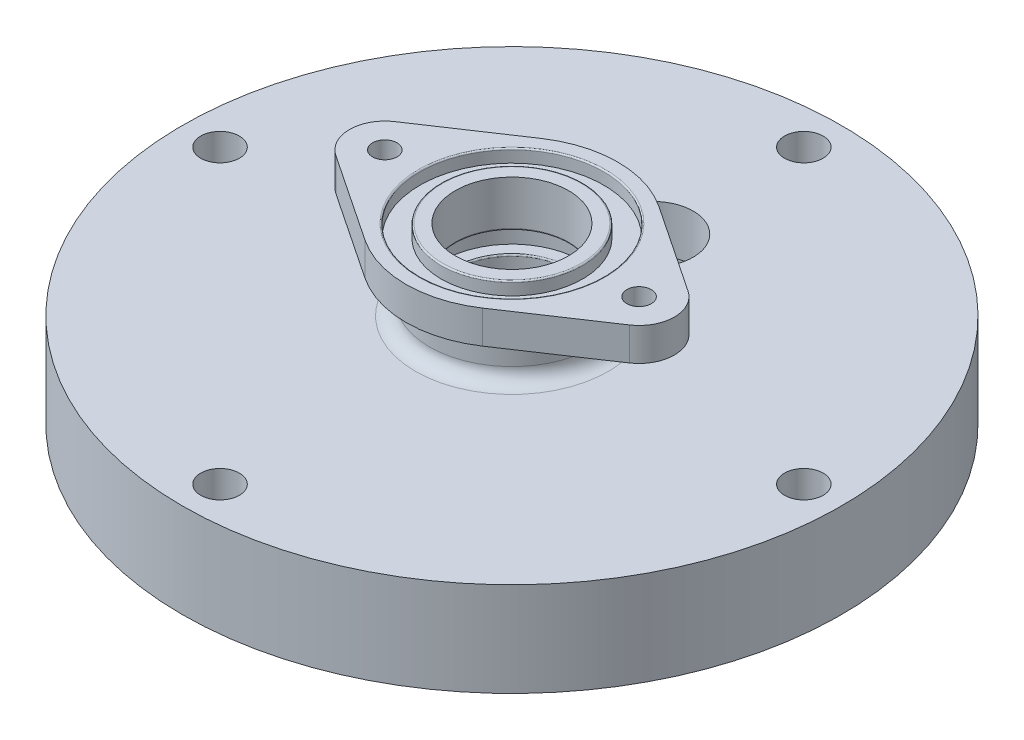
ISO-10303-21;
HEADER;
FILE_DESCRIPTION(('STEP AP214'),'2;1');
FILE_NAME('part.step','',(''),(''),'','','');
FILE_SCHEMA(('AUTOMOTIVE_DESIGN { 1 0 10303 214 1 1 1 1 }'));
ENDSEC;
DATA;
#1=APPLICATION_CONTEXT('core data for automotive mechanical design processes');
#2=APPLICATION_PROTOCOL_DEFINITION('international standard','automotive_design',2000,#1);
#3=PRODUCT_CONTEXT('',#1,'mechanical');
#4=PRODUCT('Part','Part','',(#3));
#5=PRODUCT_RELATED_PRODUCT_CATEGORY('part','',(#4));
#6=PRODUCT_DEFINITION_FORMATION('','',#4);
#7=PRODUCT_DEFINITION_CONTEXT('part definition',#1,'design');
#8=PRODUCT_DEFINITION('design','',#6,#7);
#9=PRODUCT_DEFINITION_SHAPE('','',#8);
#10=(LENGTH_UNIT() NAMED_UNIT(*) SI_UNIT(.MILLI.,.METRE.));
#11=(NAMED_UNIT(*) PLANE_ANGLE_UNIT() SI_UNIT($,.RADIAN.));
#12=(NAMED_UNIT(*) SI_UNIT($,.STERADIAN.) SOLID_ANGLE_UNIT());
#13=UNCERTAINTY_MEASURE_WITH_UNIT(LENGTH_MEASURE(1.E-05),#10,'distance_accuracy_value','');
#14=(GEOMETRIC_REPRESENTATION_CONTEXT(3) GLOBAL_UNCERTAINTY_ASSIGNED_CONTEXT((#13)) GLOBAL_UNIT_ASSIGNED_CONTEXT((#10,
#11,#12)) REPRESENTATION_CONTEXT('',''));
#15=CARTESIAN_POINT('',(0.,0.,0.));
#16=DIRECTION('',(0.,0.,1.));
#17=DIRECTION('',(1.,0.,0.));
#18=AXIS2_PLACEMENT_3D('',#15,#16,#17);
#19=CARTESIAN_POINT('',(0.,0.,0.));
#20=DIRECTION('',(0.,1.,0.));
#21=DIRECTION('',(0.,0.,1.));
#22=AXIS2_PLACEMENT_3D('',#19,#20,#21);
#23=CYLINDRICAL_SURFACE('',#22,12.025);
#24=CARTESIAN_POINT('',(0.,27.5318590738035,0.));
#25=DIRECTION('',(0.,1.,0.));
#26=DIRECTION('',(0.,0.,1.));
#27=AXIS2_PLACEMENT_3D('',#24,#25,#26);
#28=CIRCLE('',#27,12.025);
#29=CARTESIAN_POINT('',(0.,27.5318590738035,12.025));
#30=VERTEX_POINT('',#29);
#31=EDGE_CURVE('E215',#30,#30,#28,.F.);
#32=ORIENTED_EDGE('',*,*,#31,.T.);
#33=EDGE_LOOP('',(#32));
#34=FACE_BOUND('',#33,.T.);
#35=CARTESIAN_POINT('',(0.,37.,0.));
#36=DIRECTION('',(0.,1.,0.));
#37=DIRECTION('',(0.,0.,1.));
#38=AXIS2_PLACEMENT_3D('',#35,#36,#37);
#39=CIRCLE('',#38,12.025);
#40=CARTESIAN_POINT('',(0.,37.,12.025));
#41=VERTEX_POINT('',#40);
#42=EDGE_CURVE('E397',#41,#41,#39,.T.);
#43=ORIENTED_EDGE('',*,*,#42,.T.);
#44=EDGE_LOOP('',(#43));
#45=FACE_BOUND('',#44,.T.);
#46=ADVANCED_FACE('F38',(#34,#45),#23,.F.);
#47=CARTESIAN_POINT('',(-27.,37.,0.));
#48=DIRECTION('',(0.,1.,0.));
#49=DIRECTION('',(0.,0.,1.));
#50=AXIS2_PLACEMENT_3D('',#47,#48,#49);
#51=PLANE('',#50);
#52=CARTESIAN_POINT('',(0.,37.,0.));
#53=DIRECTION('',(0.,1.,0.));
#54=DIRECTION('',(0.,0.,1.));
#55=AXIS2_PLACEMENT_3D('',#52,#53,#54);
#56=CIRCLE('',#55,14.725);
#57=CARTESIAN_POINT('',(0.,37.,14.725));
#58=VERTEX_POINT('',#57);
#59=EDGE_CURVE('E197',#58,#58,#56,.T.);
#60=ORIENTED_EDGE('',*,*,#59,.T.);
#61=EDGE_LOOP('',(#60));
#62=FACE_BOUND('',#61,.T.);
#63=ORIENTED_EDGE('',*,*,#42,.F.);
#64=EDGE_LOOP('',(#63));
#65=FACE_BOUND('',#64,.T.);
#66=ADVANCED_FACE('F241',(#62,#65),#51,.T.);
#67=CARTESIAN_POINT('',(0.,20.,0.));
#68=DIRECTION('',(0.,-1.,0.));
#69=DIRECTION('',(0.,0.,-1.));
#70=AXIS2_PLACEMENT_3D('',#67,#68,#69);
#71=CYLINDRICAL_SURFACE('',#70,70.);
#72=CARTESIAN_POINT('',(0.,20.,0.));
#73=DIRECTION('',(0.,1.,0.));
#74=DIRECTION('',(0.,0.,1.));
#75=AXIS2_PLACEMENT_3D('',#72,#73,#74);
#76=CIRCLE('',#75,70.);
#77=CARTESIAN_POINT('',(0.,20.,70.));
#78=VERTEX_POINT('',#77);
#79=EDGE_CURVE('E186',#78,#78,#76,.T.);
#80=ORIENTED_EDGE('',*,*,#79,.F.);
#81=EDGE_LOOP('',(#80));
#82=FACE_BOUND('',#81,.T.);
#83=CARTESIAN_POINT('',(0.,0.,0.));
#84=DIRECTION('',(0.,1.,0.));
#85=DIRECTION('',(0.,0.,1.));
#86=AXIS2_PLACEMENT_3D('',#83,#84,#85);
#87=CIRCLE('',#86,70.);
#88=CARTESIAN_POINT('',(0.,0.,70.));
#89=VERTEX_POINT('',#88);
#90=EDGE_CURVE('E185',#89,#89,#87,.T.);
#91=ORIENTED_EDGE('',*,*,#90,.T.);
#92=EDGE_LOOP('',(#91));
#93=FACE_BOUND('',#92,.T.);
#94=ADVANCED_FACE('F247',(#82,#93),#71,.T.);
#95=CARTESIAN_POINT('',(0.,20.,0.));
#96=DIRECTION('',(0.,1.,0.));
#97=DIRECTION('',(0.,0.,1.));
#98=AXIS2_PLACEMENT_3D('',#95,#96,#97);
#99=PLANE('',#98);
#100=CARTESIAN_POINT('',(0.,20.,-30.));
#101=DIRECTION('',(0.,1.,0.));
#102=DIRECTION('',(0.,0.,1.));
#103=AXIS2_PLACEMENT_3D('',#100,#101,#102);
#104=CIRCLE('',#103,8.5);
#105=CARTESIAN_POINT('',(0.,20.,-21.5));
#106=VERTEX_POINT('',#105);
#107=EDGE_CURVE('E466',#106,#106,#104,.T.);
#108=ORIENTED_EDGE('',*,*,#107,.F.);
#109=EDGE_LOOP('',(#108));
#110=FACE_BOUND('',#109,.T.);
#111=CARTESIAN_POINT('',(0.,20.,-62.));
#112=DIRECTION('',(0.,1.,0.));
#113=DIRECTION('',(0.,0.,1.));
#114=AXIS2_PLACEMENT_3D('',#111,#112,#113);
#115=CIRCLE('',#114,4.1);
#116=CARTESIAN_POINT('',(0.,20.,-57.9));
#117=VERTEX_POINT('',#116);
#118=EDGE_CURVE('E479',#117,#117,#115,.T.);
#119=ORIENTED_EDGE('',*,*,#118,.F.);
#120=EDGE_LOOP('',(#119));
#121=FACE_BOUND('',#120,.T.);
#122=CARTESIAN_POINT('',(62.0000000000018,20.,-1.75455317453033E-12));
#123=DIRECTION('',(0.,1.,0.));
#124=DIRECTION('',(0.,0.,1.));
#125=AXIS2_PLACEMENT_3D('',#122,#123,#124);
#126=CIRCLE('',#125,4.10000000000137);
#127=CARTESIAN_POINT('',(62.0000000000018,20.,4.09999999999962));
#128=VERTEX_POINT('',#127);
#129=EDGE_CURVE('E485',#128,#128,#126,.T.);
#130=ORIENTED_EDGE('',*,*,#129,.F.);
#131=EDGE_LOOP('',(#130));
#132=FACE_BOUND('',#131,.T.);
#133=CARTESIAN_POINT('',(3.50910634906067E-12,20.,62.));
#134=DIRECTION('',(0.,1.,0.));
#135=DIRECTION('',(0.,0.,1.));
#136=AXIS2_PLACEMENT_3D('',#133,#134,#135);
#137=CIRCLE('',#136,4.10000000000377);
#138=CARTESIAN_POINT('',(3.50910634906067E-12,20.,66.1000000000038));
#139=VERTEX_POINT('',#138);
#140=EDGE_CURVE('E491',#139,#139,#137,.T.);
#141=ORIENTED_EDGE('',*,*,#140,.F.);
#142=EDGE_LOOP('',(#141));
#143=FACE_BOUND('',#142,.T.);
#144=CARTESIAN_POINT('',(-61.9999999999983,20.,1.76214598468505E-12));
#145=DIRECTION('',(0.,1.,0.));
#146=DIRECTION('',(0.,0.,1.));
#147=AXIS2_PLACEMENT_3D('',#144,#145,#146);
#148=CIRCLE('',#147,4.10000000000282);
#149=CARTESIAN_POINT('',(-61.9999999999983,20.,4.10000000000458));
#150=VERTEX_POINT('',#149);
#151=EDGE_CURVE('E472',#150,#150,#148,.T.);
#152=ORIENTED_EDGE('',*,*,#151,.F.);
#153=EDGE_LOOP('',(#152));
#154=FACE_BOUND('',#153,.T.);
#155=CARTESIAN_POINT('',(0.,20.,0.));
#156=DIRECTION('',(0.,1.,0.));
#157=DIRECTION('',(0.,0.,1.));
#158=AXIS2_PLACEMENT_3D('',#155,#156,#157);
#159=CIRCLE('',#158,20.5);
#160=CARTESIAN_POINT('',(0.,20.,20.5));
#161=VERTEX_POINT('',#160);
#162=EDGE_CURVE('E212',#161,#161,#159,.F.);
#163=ORIENTED_EDGE('',*,*,#162,.T.);
#164=EDGE_LOOP('',(#163));
#165=FACE_BOUND('',#164,.T.);
#166=ORIENTED_EDGE('',*,*,#79,.T.);
#167=EDGE_LOOP('',(#166));
#168=FACE_BOUND('',#167,.T.);
#169=ADVANCED_FACE('F331',(#110,#121,#132,#143,#154,#165,#168),#99,.T.);
#170=CARTESIAN_POINT('',(0.,0.,0.));
#171=DIRECTION('',(0.,1.,0.));
#172=DIRECTION('',(0.,0.,1.));
#173=AXIS2_PLACEMENT_3D('',#170,#171,#172);
#174=PLANE('',#173);
#175=CARTESIAN_POINT('',(0.,0.,-62.));
#176=DIRECTION('',(0.,1.,0.));
#177=DIRECTION('',(0.,0.,1.));
#178=AXIS2_PLACEMENT_3D('',#175,#176,#177);
#179=CIRCLE('',#178,4.1);
#180=CARTESIAN_POINT('',(0.,0.,-57.9));
#181=VERTEX_POINT('',#180);
#182=EDGE_CURVE('E475',#181,#181,#179,.T.);
#183=ORIENTED_EDGE('',*,*,#182,.T.);
#184=EDGE_LOOP('',(#183));
#185=FACE_BOUND('',#184,.T.);
#186=CARTESIAN_POINT('',(62.0000000000018,0.,-1.75455317453033E-12));
#187=DIRECTION('',(0.,1.,0.));
#188=DIRECTION('',(0.,0.,1.));
#189=AXIS2_PLACEMENT_3D('',#186,#187,#188);
#190=CIRCLE('',#189,4.10000000000137);
#191=CARTESIAN_POINT('',(62.0000000000018,0.,4.09999999999962));
#192=VERTEX_POINT('',#191);
#193=EDGE_CURVE('E482',#192,#192,#190,.T.);
#194=ORIENTED_EDGE('',*,*,#193,.T.);
#195=EDGE_LOOP('',(#194));
#196=FACE_BOUND('',#195,.T.);
#197=CARTESIAN_POINT('',(3.50910634906067E-12,0.,62.));
#198=DIRECTION('',(0.,1.,0.));
#199=DIRECTION('',(0.,0.,1.));
#200=AXIS2_PLACEMENT_3D('',#197,#198,#199);
#201=CIRCLE('',#200,4.10000000000377);
#202=CARTESIAN_POINT('',(3.50910634906067E-12,0.,66.1000000000038));
#203=VERTEX_POINT('',#202);
#204=EDGE_CURVE('E488',#203,#203,#201,.T.);
#205=ORIENTED_EDGE('',*,*,#204,.T.);
#206=EDGE_LOOP('',(#205));
#207=FACE_BOUND('',#206,.T.);
#208=CARTESIAN_POINT('',(-61.9999999999983,0.,1.76214598468505E-12));
#209=DIRECTION('',(0.,1.,0.));
#210=DIRECTION('',(0.,0.,1.));
#211=AXIS2_PLACEMENT_3D('',#208,#209,#210);
#212=CIRCLE('',#211,4.10000000000282);
#213=CARTESIAN_POINT('',(-61.9999999999983,0.,4.10000000000458));
#214=VERTEX_POINT('',#213);
#215=EDGE_CURVE('E494',#214,#214,#212,.T.);
#216=ORIENTED_EDGE('',*,*,#215,.T.);
#217=EDGE_LOOP('',(#216));
#218=FACE_BOUND('',#217,.T.);
#219=CARTESIAN_POINT('',(0.,0.,0.));
#220=DIRECTION('',(0.,-1.,0.));
#221=DIRECTION('',(0.,0.,-1.));
#222=AXIS2_PLACEMENT_3D('',#219,#220,#221);
#223=CIRCLE('',#222,50.03);
#224=CARTESIAN_POINT('',(0.,0.,-50.03));
#225=VERTEX_POINT('',#224);
#226=EDGE_CURVE('E182',#225,#225,#223,.T.);
#227=ORIENTED_EDGE('',*,*,#226,.F.);
#228=EDGE_LOOP('',(#227));
#229=FACE_BOUND('',#228,.T.);
#230=ORIENTED_EDGE('',*,*,#90,.F.);
#231=EDGE_LOOP('',(#230));
#232=FACE_BOUND('',#231,.T.);
#233=ADVANCED_FACE('F329',(#185,#196,#207,#218,#229,#232),#174,.F.);
#234=CARTESIAN_POINT('',(0.,10.,0.));
#235=DIRECTION('',(0.,-1.,0.));
#236=DIRECTION('',(0.,0.,-1.));
#237=AXIS2_PLACEMENT_3D('',#234,#235,#236);
#238=CYLINDRICAL_SURFACE('',#237,45.);
#239=CARTESIAN_POINT('',(0.,0.,0.));
#240=DIRECTION('',(0.,-1.,0.));
#241=DIRECTION('',(0.,0.,-1.));
#242=AXIS2_PLACEMENT_3D('',#239,#240,#241);
#243=CIRCLE('',#242,45.);
#244=CARTESIAN_POINT('',(0.,0.,-45.));
#245=VERTEX_POINT('',#244);
#246=EDGE_CURVE('E177',#245,#245,#243,.T.);
#247=ORIENTED_EDGE('',*,*,#246,.F.);
#248=EDGE_LOOP('',(#247));
#249=FACE_BOUND('',#248,.T.);
#250=CARTESIAN_POINT('',(0.,13.,0.));
#251=DIRECTION('',(0.,-1.,0.));
#252=DIRECTION('',(0.,0.,-1.));
#253=AXIS2_PLACEMENT_3D('',#250,#251,#252);
#254=CIRCLE('',#253,45.);
#255=CARTESIAN_POINT('',(0.,13.,-45.));
#256=VERTEX_POINT('',#255);
#257=EDGE_CURVE('E461',#256,#256,#254,.T.);
#258=ORIENTED_EDGE('',*,*,#257,.T.);
#259=EDGE_LOOP('',(#258));
#260=FACE_BOUND('',#259,.T.);
#261=ADVANCED_FACE('F325',(#249,#260),#238,.T.);
#262=CARTESIAN_POINT('',(0.,10.,0.));
#263=DIRECTION('',(0.,-1.,0.));
#264=DIRECTION('',(0.,0.,-1.));
#265=AXIS2_PLACEMENT_3D('',#262,#263,#264);
#266=CYLINDRICAL_SURFACE('',#265,50.03);
#267=ORIENTED_EDGE('',*,*,#226,.T.);
#268=EDGE_LOOP('',(#267));
#269=FACE_BOUND('',#268,.T.);
#270=CARTESIAN_POINT('',(0.,13.,0.));
#271=DIRECTION('',(0.,-1.,0.));
#272=DIRECTION('',(0.,0.,-1.));
#273=AXIS2_PLACEMENT_3D('',#270,#271,#272);
#274=CIRCLE('',#273,50.03);
#275=CARTESIAN_POINT('',(0.,13.,-50.03));
#276=VERTEX_POINT('',#275);
#277=EDGE_CURVE('E463',#276,#276,#274,.T.);
#278=ORIENTED_EDGE('',*,*,#277,.F.);
#279=EDGE_LOOP('',(#278));
#280=FACE_BOUND('',#279,.T.);
#281=ADVANCED_FACE('F322',(#269,#280),#266,.F.);
#282=CARTESIAN_POINT('',(0.,0.,0.));
#283=DIRECTION('',(0.,-1.,0.));
#284=DIRECTION('',(0.,0.,-1.));
#285=AXIS2_PLACEMENT_3D('',#282,#283,#284);
#286=CIRCLE('',#285,41.);
#287=CARTESIAN_POINT('',(0.,0.,-41.));
#288=VERTEX_POINT('',#287);
#289=EDGE_CURVE('E173',#288,#288,#286,.T.);
#290=ORIENTED_EDGE('',*,*,#289,.F.);
#291=EDGE_LOOP('',(#290));
#292=FACE_BOUND('',#291,.T.);
#293=ORIENTED_EDGE('',*,*,#246,.T.);
#294=EDGE_LOOP('',(#293));
#295=FACE_BOUND('',#294,.T.);
#296=ADVANCED_FACE('F320',(#292,#295),#174,.F.);
#297=CARTESIAN_POINT('',(0.,10.,0.));
#298=DIRECTION('',(0.,-1.,0.));
#299=DIRECTION('',(0.,0.,-1.));
#300=AXIS2_PLACEMENT_3D('',#297,#298,#299);
#301=CYLINDRICAL_SURFACE('',#300,41.);
#302=CARTESIAN_POINT('',(0.,10.,0.));
#303=DIRECTION('',(0.,-1.,0.));
#304=DIRECTION('',(0.,0.,-1.));
#305=AXIS2_PLACEMENT_3D('',#302,#303,#304);
#306=CIRCLE('',#305,41.);
#307=CARTESIAN_POINT('',(0.,10.,-41.));
#308=VERTEX_POINT('',#307);
#309=EDGE_CURVE('E174',#308,#308,#306,.T.);
#310=ORIENTED_EDGE('',*,*,#309,.F.);
#311=EDGE_LOOP('',(#310));
#312=FACE_BOUND('',#311,.T.);
#313=ORIENTED_EDGE('',*,*,#289,.T.);
#314=EDGE_LOOP('',(#313));
#315=FACE_BOUND('',#314,.T.);
#316=ADVANCED_FACE('F316',(#312,#315),#301,.F.);
#317=CARTESIAN_POINT('',(0.,10.,0.));
#318=DIRECTION('',(0.,-1.,0.));
#319=DIRECTION('',(0.,0.,-1.));
#320=AXIS2_PLACEMENT_3D('',#317,#318,#319);
#321=PLANE('',#320);
#322=CARTESIAN_POINT('',(0.,10.,-30.));
#323=DIRECTION('',(0.,1.,0.));
#324=DIRECTION('',(0.,0.,1.));
#325=AXIS2_PLACEMENT_3D('',#322,#323,#324);
#326=CIRCLE('',#325,8.5);
#327=CARTESIAN_POINT('',(0.,10.,-21.5));
#328=VERTEX_POINT('',#327);
#329=EDGE_CURVE('E469',#328,#328,#326,.T.);
#330=ORIENTED_EDGE('',*,*,#329,.T.);
#331=EDGE_LOOP('',(#330));
#332=FACE_BOUND('',#331,.T.);
#333=CARTESIAN_POINT('',(0.,10.,0.));
#334=DIRECTION('',(0.,-1.,0.));
#335=DIRECTION('',(0.,0.,-1.));
#336=AXIS2_PLACEMENT_3D('',#333,#334,#335);
#337=CIRCLE('',#336,17.35);
#338=CARTESIAN_POINT('',(0.,10.,-17.35));
#339=VERTEX_POINT('',#338);
#340=EDGE_CURVE('E167',#339,#339,#337,.T.);
#341=ORIENTED_EDGE('',*,*,#340,.F.);
#342=EDGE_LOOP('',(#341));
#343=FACE_BOUND('',#342,.T.);
#344=ORIENTED_EDGE('',*,*,#309,.T.);
#345=EDGE_LOOP('',(#344));
#346=FACE_BOUND('',#345,.T.);
#347=ADVANCED_FACE('F312',(#332,#343,#346),#321,.T.);
#348=CARTESIAN_POINT('',(0.,10.,0.));
#349=DIRECTION('',(0.,1.,0.));
#350=DIRECTION('',(0.,0.,1.));
#351=AXIS2_PLACEMENT_3D('',#348,#349,#350);
#352=CONICAL_SURFACE('',#351,17.35,0.358770670270572);
#353=CARTESIAN_POINT('',(0.,0.,0.));
#354=DIRECTION('',(0.,-1.,0.));
#355=DIRECTION('',(0.,0.,-1.));
#356=AXIS2_PLACEMENT_3D('',#353,#354,#355);
#357=CIRCLE('',#356,13.6);
#358=CARTESIAN_POINT('',(0.,0.,-13.6));
#359=VERTEX_POINT('',#358);
#360=EDGE_CURVE('E170',#359,#359,#357,.T.);
#361=ORIENTED_EDGE('',*,*,#360,.F.);
#362=EDGE_LOOP('',(#361));
#363=FACE_BOUND('',#362,.T.);
#364=ORIENTED_EDGE('',*,*,#340,.T.);
#365=EDGE_LOOP('',(#364));
#366=FACE_BOUND('',#365,.T.);
#367=ADVANCED_FACE('F309',(#363,#366),#352,.T.);
#368=CARTESIAN_POINT('',(0.,0.,0.));
#369=DIRECTION('',(0.,1.,0.));
#370=DIRECTION('',(0.,0.,1.));
#371=AXIS2_PLACEMENT_3D('',#368,#369,#370);
#372=CIRCLE('',#371,12.025);
#373=CARTESIAN_POINT('',(0.,0.,12.025));
#374=VERTEX_POINT('',#373);
#375=EDGE_CURVE('E400',#374,#374,#372,.T.);
#376=ORIENTED_EDGE('',*,*,#375,.T.);
#377=EDGE_LOOP('',(#376));
#378=FACE_BOUND('',#377,.T.);
#379=ORIENTED_EDGE('',*,*,#360,.T.);
#380=EDGE_LOOP('',(#379));
#381=FACE_BOUND('',#380,.T.);
#382=ADVANCED_FACE('F307',(#378,#381),#174,.F.);
#383=CARTESIAN_POINT('',(0.,30.,0.));
#384=DIRECTION('',(0.,-1.,0.));
#385=DIRECTION('',(0.,0.,-1.));
#386=AXIS2_PLACEMENT_3D('',#383,#384,#385);
#387=CYLINDRICAL_SURFACE('',#386,17.5);
#388=CARTESIAN_POINT('',(0.,27.,0.));
#389=DIRECTION('',(0.,1.,0.));
#390=DIRECTION('',(0.,0.,1.));
#391=AXIS2_PLACEMENT_3D('',#388,#389,#390);
#392=CIRCLE('',#391,17.5);
#393=CARTESIAN_POINT('',(0.,27.,17.5));
#394=VERTEX_POINT('',#393);
#395=EDGE_CURVE('E209',#394,#394,#392,.F.);
#396=ORIENTED_EDGE('',*,*,#395,.T.);
#397=EDGE_LOOP('',(#396));
#398=FACE_BOUND('',#397,.T.);
#399=CARTESIAN_POINT('',(0.,23.,0.));
#400=DIRECTION('',(0.,1.,0.));
#401=DIRECTION('',(0.,0.,1.));
#402=AXIS2_PLACEMENT_3D('',#399,#400,#401);
#403=CIRCLE('',#402,17.5);
#404=CARTESIAN_POINT('',(0.,23.,17.5));
#405=VERTEX_POINT('',#404);
#406=EDGE_CURVE('E206',#405,#405,#403,.T.);
#407=ORIENTED_EDGE('',*,*,#406,.T.);
#408=EDGE_LOOP('',(#407));
#409=FACE_BOUND('',#408,.T.);
#410=ADVANCED_FACE('F275',(#398,#409),#387,.T.);
#411=CARTESIAN_POINT('',(0.,37.,0.));
#412=DIRECTION('',(0.,1.,0.));
#413=DIRECTION('',(0.,0.,1.));
#414=AXIS2_PLACEMENT_3D('',#411,#412,#413);
#415=CIRCLE('',#414,19.825);
#416=CARTESIAN_POINT('',(0.,37.,19.825));
#417=VERTEX_POINT('',#416);
#418=EDGE_CURVE('E194',#417,#417,#415,.F.);
#419=ORIENTED_EDGE('',*,*,#418,.T.);
#420=EDGE_LOOP('',(#419));
#421=FACE_BOUND('',#420,.T.);
#422=CARTESIAN_POINT('',(-27.,37.,0.));
#423=DIRECTION('',(0.,1.,0.));
#424=DIRECTION('',(0.,0.,1.));
#425=AXIS2_PLACEMENT_3D('',#422,#423,#424);
#426=CIRCLE('',#425,2.6);
#427=CARTESIAN_POINT('',(-27.,37.,2.6));
#428=VERTEX_POINT('',#427);
#429=EDGE_CURVE('E141',#428,#428,#426,.T.);
#430=ORIENTED_EDGE('',*,*,#429,.F.);
#431=EDGE_LOOP('',(#430));
#432=FACE_BOUND('',#431,.T.);
#433=CARTESIAN_POINT('',(-27.,37.,0.));
#434=DIRECTION('',(0.,1.,0.));
#435=DIRECTION('',(0.,0.,1.));
#436=AXIS2_PLACEMENT_3D('',#433,#434,#435);
#437=CIRCLE('',#436,7.5);
#438=CARTESIAN_POINT('',(-31.1666666666667,37.,-6.23609564462323));
#439=VERTEX_POINT('',#438);
#440=CARTESIAN_POINT('',(-31.1666666666667,37.,6.23609564462324));
#441=VERTEX_POINT('',#440);
#442=EDGE_CURVE('E152',#439,#441,#437,.T.);
#443=ORIENTED_EDGE('',*,*,#442,.T.);
#444=DIRECTION('',(0.831479419283098,0.,0.555555555555556));
#445=VECTOR('',#444,1.);
#446=CARTESIAN_POINT('',(-12.5,37.,18.7082869338697));
#447=LINE('',#446,#445);
#448=CARTESIAN_POINT('',(-12.5,37.,18.7082869338697));
#449=VERTEX_POINT('',#448);
#450=EDGE_CURVE('E99',#441,#449,#447,.T.);
#451=ORIENTED_EDGE('',*,*,#450,.T.);
#452=CARTESIAN_POINT('',(0.,37.,0.));
#453=DIRECTION('',(0.,1.,0.));
#454=DIRECTION('',(0.,0.,1.));
#455=AXIS2_PLACEMENT_3D('',#452,#453,#454);
#456=CIRCLE('',#455,22.5);
#457=CARTESIAN_POINT('',(12.5,37.,18.7082869338697));
#458=VERTEX_POINT('',#457);
#459=EDGE_CURVE('E420',#449,#458,#456,.T.);
#460=ORIENTED_EDGE('',*,*,#459,.T.);
#461=DIRECTION('',(0.831479419283098,0.,-0.555555555555555));
#462=VECTOR('',#461,1.);
#463=CARTESIAN_POINT('',(31.1666666666667,37.,6.23609564462324));
#464=LINE('',#463,#462);
#465=CARTESIAN_POINT('',(31.1666666666667,37.,6.23609564462324));
#466=VERTEX_POINT('',#465);
#467=EDGE_CURVE('E422',#458,#466,#464,.T.);
#468=ORIENTED_EDGE('',*,*,#467,.T.);
#469=CARTESIAN_POINT('',(27.,37.,0.));
#470=DIRECTION('',(0.,1.,0.));
#471=DIRECTION('',(0.,0.,1.));
#472=AXIS2_PLACEMENT_3D('',#469,#470,#471);
#473=CIRCLE('',#472,7.5);
#474=CARTESIAN_POINT('',(31.1666666666667,37.,-6.23609564462323));
#475=VERTEX_POINT('',#474);
#476=EDGE_CURVE('E119',#466,#475,#473,.T.);
#477=ORIENTED_EDGE('',*,*,#476,.T.);
#478=DIRECTION('',(-0.831479419283098,0.,-0.555555555555555));
#479=VECTOR('',#478,1.);
#480=CARTESIAN_POINT('',(31.1666666666667,37.,-6.23609564462323));
#481=LINE('',#480,#479);
#482=CARTESIAN_POINT('',(12.5,37.,-18.7082869338697));
#483=VERTEX_POINT('',#482);
#484=EDGE_CURVE('E112',#475,#483,#481,.T.);
#485=ORIENTED_EDGE('',*,*,#484,.T.);
#486=CARTESIAN_POINT('',(0.,37.,0.));
#487=DIRECTION('',(0.,1.,0.));
#488=DIRECTION('',(0.,0.,1.));
#489=AXIS2_PLACEMENT_3D('',#486,#487,#488);
#490=CIRCLE('',#489,22.5);
#491=CARTESIAN_POINT('',(-12.5,37.,-18.7082869338697));
#492=VERTEX_POINT('',#491);
#493=EDGE_CURVE('E117',#483,#492,#490,.T.);
#494=ORIENTED_EDGE('',*,*,#493,.T.);
#495=DIRECTION('',(-0.831479419283098,0.,0.555555555555556));
#496=VECTOR('',#495,1.);
#497=CARTESIAN_POINT('',(-12.5,37.,-18.7082869338697));
#498=LINE('',#497,#496);
#499=EDGE_CURVE('E55',#492,#439,#498,.T.);
#500=ORIENTED_EDGE('',*,*,#499,.T.);
#501=EDGE_LOOP('',(#443,#451,#460,#468,#477,#485,#494,#500));
#502=FACE_BOUND('',#501,.T.);
#503=CARTESIAN_POINT('',(27.,37.,0.));
#504=DIRECTION('',(0.,1.,0.));
#505=DIRECTION('',(0.,0.,1.));
#506=AXIS2_PLACEMENT_3D('',#503,#504,#505);
#507=CIRCLE('',#506,2.6);
#508=CARTESIAN_POINT('',(27.,37.,2.6));
#509=VERTEX_POINT('',#508);
#510=EDGE_CURVE('E409',#509,#509,#507,.T.);
#511=ORIENTED_EDGE('',*,*,#510,.F.);
#512=EDGE_LOOP('',(#511));
#513=FACE_BOUND('',#512,.T.);
#514=ADVANCED_FACE('F114',(#421,#432,#502,#513),#51,.T.);
#515=CARTESIAN_POINT('',(-27.,30.,0.));
#516=DIRECTION('',(0.,1.,0.));
#517=DIRECTION('',(0.,0.,1.));
#518=AXIS2_PLACEMENT_3D('',#515,#516,#517);
#519=PLANE('',#518);
#520=CARTESIAN_POINT('',(0.,30.,0.));
#521=DIRECTION('',(0.,1.,0.));
#522=DIRECTION('',(0.,0.,1.));
#523=AXIS2_PLACEMENT_3D('',#520,#521,#522);
#524=CIRCLE('',#523,20.5);
#525=CARTESIAN_POINT('',(0.,30.,20.5));
#526=VERTEX_POINT('',#525);
#527=EDGE_CURVE('E203',#526,#526,#524,.T.);
#528=ORIENTED_EDGE('',*,*,#527,.T.);
#529=EDGE_LOOP('',(#528));
#530=FACE_BOUND('',#529,.T.);
#531=CARTESIAN_POINT('',(-27.,30.,0.));
#532=DIRECTION('',(0.,1.,0.));
#533=DIRECTION('',(0.,0.,1.));
#534=AXIS2_PLACEMENT_3D('',#531,#532,#533);
#535=CIRCLE('',#534,7.5);
#536=CARTESIAN_POINT('',(-31.1666666666667,30.,-6.23609564462323));
#537=VERTEX_POINT('',#536);
#538=CARTESIAN_POINT('',(-31.1666666666667,30.,6.23609564462324));
#539=VERTEX_POINT('',#538);
#540=EDGE_CURVE('E137',#537,#539,#535,.T.);
#541=ORIENTED_EDGE('',*,*,#540,.F.);
#542=DIRECTION('',(-0.831479419283098,0.,0.555555555555556));
#543=VECTOR('',#542,1.);
#544=CARTESIAN_POINT('',(-12.5,30.,-18.7082869338697));
#545=LINE('',#544,#543);
#546=CARTESIAN_POINT('',(-12.5,30.,-18.7082869338697));
#547=VERTEX_POINT('',#546);
#548=EDGE_CURVE('E90',#547,#537,#545,.T.);
#549=ORIENTED_EDGE('',*,*,#548,.F.);
#550=CARTESIAN_POINT('',(0.,30.,0.));
#551=DIRECTION('',(0.,1.,0.));
#552=DIRECTION('',(0.,0.,1.));
#553=AXIS2_PLACEMENT_3D('',#550,#551,#552);
#554=CIRCLE('',#553,22.5);
#555=CARTESIAN_POINT('',(12.5,30.,-18.7082869338697));
#556=VERTEX_POINT('',#555);
#557=EDGE_CURVE('E84',#556,#547,#554,.T.);
#558=ORIENTED_EDGE('',*,*,#557,.F.);
#559=DIRECTION('',(-0.831479419283098,0.,-0.555555555555555));
#560=VECTOR('',#559,1.);
#561=CARTESIAN_POINT('',(31.1666666666667,30.,-6.23609564462323));
#562=LINE('',#561,#560);
#563=CARTESIAN_POINT('',(31.1666666666667,30.,-6.23609564462323));
#564=VERTEX_POINT('',#563);
#565=EDGE_CURVE('E127',#564,#556,#562,.T.);
#566=ORIENTED_EDGE('',*,*,#565,.F.);
#567=CARTESIAN_POINT('',(27.,30.,0.));
#568=DIRECTION('',(0.,1.,0.));
#569=DIRECTION('',(0.,0.,1.));
#570=AXIS2_PLACEMENT_3D('',#567,#568,#569);
#571=CIRCLE('',#570,7.5);
#572=CARTESIAN_POINT('',(31.1666666666667,30.,6.23609564462324));
#573=VERTEX_POINT('',#572);
#574=EDGE_CURVE('E147',#573,#564,#571,.T.);
#575=ORIENTED_EDGE('',*,*,#574,.F.);
#576=DIRECTION('',(0.831479419283098,0.,-0.555555555555555));
#577=VECTOR('',#576,1.);
#578=CARTESIAN_POINT('',(31.1666666666667,30.,6.23609564462324));
#579=LINE('',#578,#577);
#580=CARTESIAN_POINT('',(12.5,30.,18.7082869338697));
#581=VERTEX_POINT('',#580);
#582=EDGE_CURVE('E145',#581,#573,#579,.T.);
#583=ORIENTED_EDGE('',*,*,#582,.F.);
#584=CARTESIAN_POINT('',(0.,30.,0.));
#585=DIRECTION('',(0.,1.,0.));
#586=DIRECTION('',(0.,0.,1.));
#587=AXIS2_PLACEMENT_3D('',#584,#585,#586);
#588=CIRCLE('',#587,22.5);
#589=CARTESIAN_POINT('',(-12.5,30.,18.7082869338697));
#590=VERTEX_POINT('',#589);
#591=EDGE_CURVE('E143',#590,#581,#588,.T.);
#592=ORIENTED_EDGE('',*,*,#591,.F.);
#593=DIRECTION('',(0.831479419283098,0.,0.555555555555556));
#594=VECTOR('',#593,1.);
#595=CARTESIAN_POINT('',(-12.5,30.,18.7082869338697));
#596=LINE('',#595,#594);
#597=EDGE_CURVE('E140',#539,#590,#596,.T.);
#598=ORIENTED_EDGE('',*,*,#597,.F.);
#599=EDGE_LOOP('',(#541,#549,#558,#566,#575,#583,#592,#598));
#600=FACE_BOUND('',#599,.T.);
#601=CARTESIAN_POINT('',(-27.,30.,0.));
#602=DIRECTION('',(0.,1.,0.));
#603=DIRECTION('',(0.,0.,1.));
#604=AXIS2_PLACEMENT_3D('',#601,#602,#603);
#605=CIRCLE('',#604,2.6);
#606=CARTESIAN_POINT('',(-27.,30.,2.6));
#607=VERTEX_POINT('',#606);
#608=EDGE_CURVE('E411',#607,#607,#605,.T.);
#609=ORIENTED_EDGE('',*,*,#608,.T.);
#610=EDGE_LOOP('',(#609));
#611=FACE_BOUND('',#610,.T.);
#612=CARTESIAN_POINT('',(27.,30.,0.));
#613=DIRECTION('',(0.,1.,0.));
#614=DIRECTION('',(0.,0.,1.));
#615=AXIS2_PLACEMENT_3D('',#612,#613,#614);
#616=CIRCLE('',#615,2.6);
#617=CARTESIAN_POINT('',(27.,30.,2.6));
#618=VERTEX_POINT('',#617);
#619=EDGE_CURVE('E407',#618,#618,#616,.T.);
#620=ORIENTED_EDGE('',*,*,#619,.T.);
#621=EDGE_LOOP('',(#620));
#622=FACE_BOUND('',#621,.T.);
#623=ADVANCED_FACE('F274',(#530,#600,#611,#622),#519,.F.);
#624=CARTESIAN_POINT('',(-27.,37.,0.));
#625=DIRECTION('',(0.,-1.,0.));
#626=DIRECTION('',(0.,0.,-1.));
#627=AXIS2_PLACEMENT_3D('',#624,#625,#626);
#628=CYLINDRICAL_SURFACE('',#627,7.5);
#629=ORIENTED_EDGE('',*,*,#540,.T.);
#630=DIRECTION('',(0.,-1.,0.));
#631=VECTOR('',#630,1.);
#632=CARTESIAN_POINT('',(-31.1666666666667,37.,6.23609564462324));
#633=LINE('',#632,#631);
#634=EDGE_CURVE('E165',#441,#539,#633,.T.);
#635=ORIENTED_EDGE('',*,*,#634,.F.);
#636=ORIENTED_EDGE('',*,*,#442,.F.);
#637=DIRECTION('',(0.,-1.,0.));
#638=VECTOR('',#637,1.);
#639=CARTESIAN_POINT('',(-31.1666666666667,37.,-6.23609564462323));
#640=LINE('',#639,#638);
#641=EDGE_CURVE('E133',#439,#537,#640,.T.);
#642=ORIENTED_EDGE('',*,*,#641,.T.);
#643=EDGE_LOOP('',(#629,#635,#636,#642));
#644=FACE_BOUND('',#643,.T.);
#645=ADVANCED_FACE('F279',(#644),#628,.T.);
#646=CARTESIAN_POINT('',(-12.5,37.,18.7082869338697));
#647=DIRECTION('',(0.555555555555556,0.,-0.831479419283098));
#648=DIRECTION('',(-0.831479419283098,0.,-0.555555555555556));
#649=AXIS2_PLACEMENT_3D('',#646,#647,#648);
#650=PLANE('',#649);
#651=ORIENTED_EDGE('',*,*,#597,.T.);
#652=DIRECTION('',(0.,-1.,0.));
#653=VECTOR('',#652,1.);
#654=CARTESIAN_POINT('',(-12.5,37.,18.7082869338697));
#655=LINE('',#654,#653);
#656=EDGE_CURVE('E162',#449,#590,#655,.T.);
#657=ORIENTED_EDGE('',*,*,#656,.F.);
#658=ORIENTED_EDGE('',*,*,#450,.F.);
#659=ORIENTED_EDGE('',*,*,#634,.T.);
#660=EDGE_LOOP('',(#651,#657,#658,#659));
#661=FACE_BOUND('',#660,.T.);
#662=ADVANCED_FACE('F298',(#661),#650,.F.);
#663=CARTESIAN_POINT('',(0.,37.,0.));
#664=DIRECTION('',(0.,-1.,0.));
#665=DIRECTION('',(0.,0.,-1.));
#666=AXIS2_PLACEMENT_3D('',#663,#664,#665);
#667=CYLINDRICAL_SURFACE('',#666,22.5);
#668=ORIENTED_EDGE('',*,*,#591,.T.);
#669=DIRECTION('',(0.,-1.,0.));
#670=VECTOR('',#669,1.);
#671=CARTESIAN_POINT('',(12.5,37.,18.7082869338697));
#672=LINE('',#671,#670);
#673=EDGE_CURVE('E159',#458,#581,#672,.T.);
#674=ORIENTED_EDGE('',*,*,#673,.F.);
#675=ORIENTED_EDGE('',*,*,#459,.F.);
#676=ORIENTED_EDGE('',*,*,#656,.T.);
#677=EDGE_LOOP('',(#668,#674,#675,#676));
#678=FACE_BOUND('',#677,.T.);
#679=ADVANCED_FACE('F294',(#678),#667,.T.);
#680=CARTESIAN_POINT('',(31.1666666666667,37.,6.23609564462324));
#681=DIRECTION('',(-0.555555555555555,0.,-0.831479419283098));
#682=DIRECTION('',(-0.831479419283098,0.,0.555555555555555));
#683=AXIS2_PLACEMENT_3D('',#680,#681,#682);
#684=PLANE('',#683);
#685=ORIENTED_EDGE('',*,*,#582,.T.);
#686=DIRECTION('',(0.,-1.,0.));
#687=VECTOR('',#686,1.);
#688=CARTESIAN_POINT('',(31.1666666666667,37.,6.23609564462324));
#689=LINE('',#688,#687);
#690=EDGE_CURVE('E156',#466,#573,#689,.T.);
#691=ORIENTED_EDGE('',*,*,#690,.F.);
#692=ORIENTED_EDGE('',*,*,#467,.F.);
#693=ORIENTED_EDGE('',*,*,#673,.T.);
#694=EDGE_LOOP('',(#685,#691,#692,#693));
#695=FACE_BOUND('',#694,.T.);
#696=ADVANCED_FACE('F290',(#695),#684,.F.);
#697=CARTESIAN_POINT('',(27.,37.,0.));
#698=DIRECTION('',(0.,-1.,0.));
#699=DIRECTION('',(0.,0.,-1.));
#700=AXIS2_PLACEMENT_3D('',#697,#698,#699);
#701=CYLINDRICAL_SURFACE('',#700,7.5);
#702=ORIENTED_EDGE('',*,*,#574,.T.);
#703=DIRECTION('',(0.,-1.,0.));
#704=VECTOR('',#703,1.);
#705=CARTESIAN_POINT('',(31.1666666666667,37.,-6.23609564462323));
#706=LINE('',#705,#704);
#707=EDGE_CURVE('E128',#475,#564,#706,.T.);
#708=ORIENTED_EDGE('',*,*,#707,.F.);
#709=ORIENTED_EDGE('',*,*,#476,.F.);
#710=ORIENTED_EDGE('',*,*,#690,.T.);
#711=EDGE_LOOP('',(#702,#708,#709,#710));
#712=FACE_BOUND('',#711,.T.);
#713=ADVANCED_FACE('F287',(#712),#701,.T.);
#714=CARTESIAN_POINT('',(31.1666666666667,37.,-6.23609564462323));
#715=DIRECTION('',(-0.555555555555555,0.,0.831479419283098));
#716=DIRECTION('',(0.831479419283098,0.,0.555555555555555));
#717=AXIS2_PLACEMENT_3D('',#714,#715,#716);
#718=PLANE('',#717);
#719=ORIENTED_EDGE('',*,*,#565,.T.);
#720=DIRECTION('',(0.,-1.,0.));
#721=VECTOR('',#720,1.);
#722=CARTESIAN_POINT('',(12.5,37.,-18.7082869338697));
#723=LINE('',#722,#721);
#724=EDGE_CURVE('E124',#483,#556,#723,.T.);
#725=ORIENTED_EDGE('',*,*,#724,.F.);
#726=ORIENTED_EDGE('',*,*,#484,.F.);
#727=ORIENTED_EDGE('',*,*,#707,.T.);
#728=EDGE_LOOP('',(#719,#725,#726,#727));
#729=FACE_BOUND('',#728,.T.);
#730=ADVANCED_FACE('F125',(#729),#718,.F.);
#731=CARTESIAN_POINT('',(0.,37.,0.));
#732=DIRECTION('',(0.,-1.,0.));
#733=DIRECTION('',(0.,0.,-1.));
#734=AXIS2_PLACEMENT_3D('',#731,#732,#733);
#735=CYLINDRICAL_SURFACE('',#734,22.5);
#736=ORIENTED_EDGE('',*,*,#557,.T.);
#737=DIRECTION('',(0.,-1.,0.));
#738=VECTOR('',#737,1.);
#739=CARTESIAN_POINT('',(-12.5,37.,-18.7082869338697));
#740=LINE('',#739,#738);
#741=EDGE_CURVE('E129',#492,#547,#740,.T.);
#742=ORIENTED_EDGE('',*,*,#741,.F.);
#743=ORIENTED_EDGE('',*,*,#493,.F.);
#744=ORIENTED_EDGE('',*,*,#724,.T.);
#745=EDGE_LOOP('',(#736,#742,#743,#744));
#746=FACE_BOUND('',#745,.T.);
#747=ADVANCED_FACE('F131',(#746),#735,.T.);
#748=CARTESIAN_POINT('',(-12.5,37.,-18.7082869338697));
#749=DIRECTION('',(0.555555555555556,0.,0.831479419283098));
#750=DIRECTION('',(0.831479419283098,0.,-0.555555555555556));
#751=AXIS2_PLACEMENT_3D('',#748,#749,#750);
#752=PLANE('',#751);
#753=ORIENTED_EDGE('',*,*,#548,.T.);
#754=ORIENTED_EDGE('',*,*,#641,.F.);
#755=ORIENTED_EDGE('',*,*,#499,.F.);
#756=ORIENTED_EDGE('',*,*,#741,.T.);
#757=EDGE_LOOP('',(#753,#754,#755,#756));
#758=FACE_BOUND('',#757,.T.);
#759=ADVANCED_FACE('F267',(#758),#752,.F.);
#760=CARTESIAN_POINT('',(-27.,37.,0.));
#761=DIRECTION('',(0.,-1.,0.));
#762=DIRECTION('',(0.,0.,-1.));
#763=AXIS2_PLACEMENT_3D('',#760,#761,#762);
#764=CYLINDRICAL_SURFACE('',#763,2.6);
#765=ORIENTED_EDGE('',*,*,#429,.T.);
#766=EDGE_LOOP('',(#765));
#767=FACE_BOUND('',#766,.T.);
#768=ORIENTED_EDGE('',*,*,#608,.F.);
#769=EDGE_LOOP('',(#768));
#770=FACE_BOUND('',#769,.T.);
#771=ADVANCED_FACE('F262',(#767,#770),#764,.F.);
#772=CARTESIAN_POINT('',(27.,37.,0.));
#773=DIRECTION('',(0.,-1.,0.));
#774=DIRECTION('',(0.,0.,-1.));
#775=AXIS2_PLACEMENT_3D('',#772,#773,#774);
#776=CYLINDRICAL_SURFACE('',#775,2.6);
#777=ORIENTED_EDGE('',*,*,#510,.T.);
#778=EDGE_LOOP('',(#777));
#779=FACE_BOUND('',#778,.T.);
#780=ORIENTED_EDGE('',*,*,#619,.F.);
#781=EDGE_LOOP('',(#780));
#782=FACE_BOUND('',#781,.T.);
#783=ADVANCED_FACE('F255',(#779,#782),#776,.F.);
#784=CARTESIAN_POINT('',(0.,22.4318590738035,0.));
#785=DIRECTION('',(0.,-1.,0.));
#786=DIRECTION('',(0.,0.,-1.));
#787=AXIS2_PLACEMENT_3D('',#784,#785,#786);
#788=CIRCLE('',#787,12.025);
#789=CARTESIAN_POINT('',(0.,22.4318590738035,-12.025));
#790=VERTEX_POINT('',#789);
#791=EDGE_CURVE('E47',#790,#790,#788,.F.);
#792=ORIENTED_EDGE('',*,*,#791,.T.);
#793=EDGE_LOOP('',(#792));
#794=FACE_BOUND('',#793,.T.);
#795=ORIENTED_EDGE('',*,*,#375,.F.);
#796=EDGE_LOOP('',(#795));
#797=FACE_BOUND('',#796,.T.);
#798=ADVANCED_FACE('F223',(#794,#797),#23,.F.);
#799=CARTESIAN_POINT('',(0.,34.25,0.));
#800=DIRECTION('',(0.,1.,0.));
#801=DIRECTION('',(0.,0.,1.));
#802=AXIS2_PLACEMENT_3D('',#799,#800,#801);
#803=CYLINDRICAL_SURFACE('',#802,19.525);
#804=CARTESIAN_POINT('',(0.,36.7,0.));
#805=DIRECTION('',(0.,1.,0.));
#806=DIRECTION('',(0.,0.,1.));
#807=AXIS2_PLACEMENT_3D('',#804,#805,#806);
#808=CIRCLE('',#807,19.525);
#809=CARTESIAN_POINT('',(0.,36.7,19.525));
#810=VERTEX_POINT('',#809);
#811=EDGE_CURVE('E189',#810,#810,#808,.T.);
#812=ORIENTED_EDGE('',*,*,#811,.T.);
#813=EDGE_LOOP('',(#812));
#814=FACE_BOUND('',#813,.T.);
#815=CARTESIAN_POINT('',(0.,34.25,0.));
#816=DIRECTION('',(0.,1.,0.));
#817=DIRECTION('',(0.,0.,1.));
#818=AXIS2_PLACEMENT_3D('',#815,#816,#817);
#819=CIRCLE('',#818,19.525);
#820=CARTESIAN_POINT('',(0.,34.25,19.525));
#821=VERTEX_POINT('',#820);
#822=EDGE_CURVE('E395',#821,#821,#819,.T.);
#823=ORIENTED_EDGE('',*,*,#822,.F.);
#824=EDGE_LOOP('',(#823));
#825=FACE_BOUND('',#824,.T.);
#826=ADVANCED_FACE('F254',(#814,#825),#803,.F.);
#827=CARTESIAN_POINT('',(0.,34.25,0.));
#828=DIRECTION('',(0.,1.,0.));
#829=DIRECTION('',(0.,0.,1.));
#830=AXIS2_PLACEMENT_3D('',#827,#828,#829);
#831=PLANE('',#830);
#832=CARTESIAN_POINT('',(0.,34.25,0.));
#833=DIRECTION('',(0.,1.,0.));
#834=DIRECTION('',(0.,0.,1.));
#835=AXIS2_PLACEMENT_3D('',#832,#833,#834);
#836=CIRCLE('',#835,15.025);
#837=CARTESIAN_POINT('',(0.,34.25,15.025));
#838=VERTEX_POINT('',#837);
#839=EDGE_CURVE('E392',#838,#838,#836,.T.);
#840=ORIENTED_EDGE('',*,*,#839,.F.);
#841=EDGE_LOOP('',(#840));
#842=FACE_BOUND('',#841,.T.);
#843=ORIENTED_EDGE('',*,*,#822,.T.);
#844=EDGE_LOOP('',(#843));
#845=FACE_BOUND('',#844,.T.);
#846=ADVANCED_FACE('F260',(#842,#845),#831,.T.);
#847=CARTESIAN_POINT('',(0.,34.25,0.));
#848=DIRECTION('',(0.,1.,0.));
#849=DIRECTION('',(0.,0.,1.));
#850=AXIS2_PLACEMENT_3D('',#847,#848,#849);
#851=CYLINDRICAL_SURFACE('',#850,15.025);
#852=CARTESIAN_POINT('',(0.,36.7,0.));
#853=DIRECTION('',(0.,1.,0.));
#854=DIRECTION('',(0.,0.,1.));
#855=AXIS2_PLACEMENT_3D('',#852,#853,#854);
#856=CIRCLE('',#855,15.025);
#857=CARTESIAN_POINT('',(0.,36.7,15.025));
#858=VERTEX_POINT('',#857);
#859=EDGE_CURVE('E200',#858,#858,#856,.F.);
#860=ORIENTED_EDGE('',*,*,#859,.T.);
#861=EDGE_LOOP('',(#860));
#862=FACE_BOUND('',#861,.T.);
#863=ORIENTED_EDGE('',*,*,#839,.T.);
#864=EDGE_LOOP('',(#863));
#865=FACE_BOUND('',#864,.T.);
#866=ADVANCED_FACE('F345',(#862,#865),#851,.T.);
#867=CARTESIAN_POINT('',(0.,36.7,0.));
#868=DIRECTION('',(0.,1.,0.));
#869=DIRECTION('',(0.,0.,1.));
#870=AXIS2_PLACEMENT_3D('',#867,#868,#869);
#871=TOROIDAL_SURFACE('',#870,19.825,0.3);
#872=ORIENTED_EDGE('',*,*,#418,.F.);
#873=EDGE_LOOP('',(#872));
#874=FACE_BOUND('',#873,.T.);
#875=ORIENTED_EDGE('',*,*,#811,.F.);
#876=EDGE_LOOP('',(#875));
#877=FACE_BOUND('',#876,.T.);
#878=ADVANCED_FACE('F341',(#874,#877),#871,.T.);
#879=CARTESIAN_POINT('',(0.,36.7,0.));
#880=DIRECTION('',(0.,1.,0.));
#881=DIRECTION('',(0.,0.,1.));
#882=AXIS2_PLACEMENT_3D('',#879,#880,#881);
#883=TOROIDAL_SURFACE('',#882,14.725,0.3);
#884=ORIENTED_EDGE('',*,*,#859,.F.);
#885=EDGE_LOOP('',(#884));
#886=FACE_BOUND('',#885,.T.);
#887=ORIENTED_EDGE('',*,*,#59,.F.);
#888=EDGE_LOOP('',(#887));
#889=FACE_BOUND('',#888,.T.);
#890=ADVANCED_FACE('F344',(#886,#889),#883,.T.);
#891=CARTESIAN_POINT('',(0.,27.,0.));
#892=DIRECTION('',(0.,1.,0.));
#893=DIRECTION('',(0.,0.,1.));
#894=AXIS2_PLACEMENT_3D('',#891,#892,#893);
#895=TOROIDAL_SURFACE('',#894,20.5,3.);
#896=ORIENTED_EDGE('',*,*,#395,.F.);
#897=EDGE_LOOP('',(#896));
#898=FACE_BOUND('',#897,.T.);
#899=ORIENTED_EDGE('',*,*,#527,.F.);
#900=EDGE_LOOP('',(#899));
#901=FACE_BOUND('',#900,.T.);
#902=ADVANCED_FACE('F349',(#898,#901),#895,.F.);
#903=CARTESIAN_POINT('',(0.,23.,0.));
#904=DIRECTION('',(0.,1.,0.));
#905=DIRECTION('',(0.,0.,1.));
#906=AXIS2_PLACEMENT_3D('',#903,#904,#905);
#907=TOROIDAL_SURFACE('',#906,20.5,3.);
#908=ORIENTED_EDGE('',*,*,#162,.F.);
#909=EDGE_LOOP('',(#908));
#910=FACE_BOUND('',#909,.T.);
#911=ORIENTED_EDGE('',*,*,#406,.F.);
#912=EDGE_LOOP('',(#911));
#913=FACE_BOUND('',#912,.T.);
#914=ADVANCED_FACE('F353',(#910,#913),#907,.F.);
#915=CARTESIAN_POINT('',(0.,27.2318590738035,0.));
#916=DIRECTION('',(0.,1.,0.));
#917=DIRECTION('',(0.,0.,1.));
#918=AXIS2_PLACEMENT_3D('',#915,#916,#917);
#919=PLANE('',#918);
#920=CARTESIAN_POINT('',(0.,27.2318590738035,0.));
#921=DIRECTION('',(0.,1.,0.));
#922=DIRECTION('',(0.,0.,1.));
#923=AXIS2_PLACEMENT_3D('',#920,#921,#922);
#924=CIRCLE('',#923,12.325);
#925=CARTESIAN_POINT('',(0.,27.2318590738035,12.325));
#926=VERTEX_POINT('',#925);
#927=EDGE_CURVE('E218',#926,#926,#924,.T.);
#928=ORIENTED_EDGE('',*,*,#927,.T.);
#929=EDGE_LOOP('',(#928));
#930=FACE_BOUND('',#929,.T.);
#931=CARTESIAN_POINT('',(0.,27.2318590738035,0.));
#932=DIRECTION('',(0.,-1.,0.));
#933=DIRECTION('',(0.,0.,-1.));
#934=AXIS2_PLACEMENT_3D('',#931,#932,#933);
#935=CIRCLE('',#934,14.75);
#936=CARTESIAN_POINT('',(0.,27.2318590738035,-14.75));
#937=VERTEX_POINT('',#936);
#938=EDGE_CURVE('E402',#937,#937,#935,.T.);
#939=ORIENTED_EDGE('',*,*,#938,.T.);
#940=EDGE_LOOP('',(#939));
#941=FACE_BOUND('',#940,.T.);
#942=ADVANCED_FACE('F356',(#930,#941),#919,.F.);
#943=CARTESIAN_POINT('',(0.,22.7318590738035,0.));
#944=DIRECTION('',(0.,-1.,0.));
#945=DIRECTION('',(0.,0.,-1.));
#946=AXIS2_PLACEMENT_3D('',#943,#944,#945);
#947=PLANE('',#946);
#948=CARTESIAN_POINT('',(0.,22.7318590738035,0.));
#949=DIRECTION('',(0.,-1.,0.));
#950=DIRECTION('',(0.,0.,-1.));
#951=AXIS2_PLACEMENT_3D('',#948,#949,#950);
#952=CIRCLE('',#951,12.325);
#953=CARTESIAN_POINT('',(0.,22.7318590738035,-12.325));
#954=VERTEX_POINT('',#953);
#955=EDGE_CURVE('E12',#954,#954,#952,.T.);
#956=ORIENTED_EDGE('',*,*,#955,.T.);
#957=EDGE_LOOP('',(#956));
#958=FACE_BOUND('',#957,.T.);
#959=CARTESIAN_POINT('',(0.,22.7318590738035,0.));
#960=DIRECTION('',(0.,-1.,0.));
#961=DIRECTION('',(0.,0.,-1.));
#962=AXIS2_PLACEMENT_3D('',#959,#960,#961);
#963=CIRCLE('',#962,14.75);
#964=CARTESIAN_POINT('',(0.,22.7318590738035,-14.75));
#965=VERTEX_POINT('',#964);
#966=EDGE_CURVE('E478',#965,#965,#963,.T.);
#967=ORIENTED_EDGE('',*,*,#966,.F.);
#968=EDGE_LOOP('',(#967));
#969=FACE_BOUND('',#968,.T.);
#970=ADVANCED_FACE('F361',(#958,#969),#947,.F.);
#971=CARTESIAN_POINT('',(0.,0.,0.));
#972=DIRECTION('',(0.,-1.,0.));
#973=DIRECTION('',(0.,0.,-1.));
#974=AXIS2_PLACEMENT_3D('',#971,#972,#973);
#975=CYLINDRICAL_SURFACE('',#974,14.75);
#976=ORIENTED_EDGE('',*,*,#938,.F.);
#977=EDGE_LOOP('',(#976));
#978=FACE_BOUND('',#977,.T.);
#979=ORIENTED_EDGE('',*,*,#966,.T.);
#980=EDGE_LOOP('',(#979));
#981=FACE_BOUND('',#980,.T.);
#982=ADVANCED_FACE('F237',(#978,#981),#975,.F.);
#983=CARTESIAN_POINT('',(0.,27.5318590738035,0.));
#984=DIRECTION('',(0.,1.,0.));
#985=DIRECTION('',(0.,0.,1.));
#986=AXIS2_PLACEMENT_3D('',#983,#984,#985);
#987=TOROIDAL_SURFACE('',#986,12.325,0.3);
#988=ORIENTED_EDGE('',*,*,#927,.F.);
#989=EDGE_LOOP('',(#988));
#990=FACE_BOUND('',#989,.T.);
#991=ORIENTED_EDGE('',*,*,#31,.F.);
#992=EDGE_LOOP('',(#991));
#993=FACE_BOUND('',#992,.T.);
#994=ADVANCED_FACE('F228',(#990,#993),#987,.T.);
#995=CARTESIAN_POINT('',(0.,22.4318590738035,0.));
#996=DIRECTION('',(0.,-1.,0.));
#997=DIRECTION('',(0.,0.,-1.));
#998=AXIS2_PLACEMENT_3D('',#995,#996,#997);
#999=TOROIDAL_SURFACE('',#998,12.325,0.3);
#1000=ORIENTED_EDGE('',*,*,#955,.F.);
#1001=EDGE_LOOP('',(#1000));
#1002=FACE_BOUND('',#1001,.T.);
#1003=ORIENTED_EDGE('',*,*,#791,.F.);
#1004=EDGE_LOOP('',(#1003));
#1005=FACE_BOUND('',#1004,.T.);
#1006=ADVANCED_FACE('F40',(#1002,#1005),#999,.T.);
#1007=CARTESIAN_POINT('',(-61.9999999999983,0.,1.76214598468505E-12));
#1008=DIRECTION('',(0.,1.,0.));
#1009=DIRECTION('',(0.,0.,1.));
#1010=AXIS2_PLACEMENT_3D('',#1007,#1008,#1009);
#1011=CYLINDRICAL_SURFACE('',#1010,4.10000000000282);
#1012=ORIENTED_EDGE('',*,*,#215,.F.);
#1013=EDGE_LOOP('',(#1012));
#1014=FACE_BOUND('',#1013,.T.);
#1015=ORIENTED_EDGE('',*,*,#151,.T.);
#1016=EDGE_LOOP('',(#1015));
#1017=FACE_BOUND('',#1016,.T.);
#1018=ADVANCED_FACE('F227',(#1014,#1017),#1011,.F.);
#1019=CARTESIAN_POINT('',(3.50910634906067E-12,0.,62.));
#1020=DIRECTION('',(0.,1.,0.));
#1021=DIRECTION('',(0.,0.,1.));
#1022=AXIS2_PLACEMENT_3D('',#1019,#1020,#1021);
#1023=CYLINDRICAL_SURFACE('',#1022,4.10000000000377);
#1024=ORIENTED_EDGE('',*,*,#204,.F.);
#1025=EDGE_LOOP('',(#1024));
#1026=FACE_BOUND('',#1025,.T.);
#1027=ORIENTED_EDGE('',*,*,#140,.T.);
#1028=EDGE_LOOP('',(#1027));
#1029=FACE_BOUND('',#1028,.T.);
#1030=ADVANCED_FACE('F234',(#1026,#1029),#1023,.F.);
#1031=CARTESIAN_POINT('',(62.0000000000018,0.,-1.75455317453033E-12));
#1032=DIRECTION('',(0.,1.,0.));
#1033=DIRECTION('',(0.,0.,1.));
#1034=AXIS2_PLACEMENT_3D('',#1031,#1032,#1033);
#1035=CYLINDRICAL_SURFACE('',#1034,4.10000000000137);
#1036=ORIENTED_EDGE('',*,*,#193,.F.);
#1037=EDGE_LOOP('',(#1036));
#1038=FACE_BOUND('',#1037,.T.);
#1039=ORIENTED_EDGE('',*,*,#129,.T.);
#1040=EDGE_LOOP('',(#1039));
#1041=FACE_BOUND('',#1040,.T.);
#1042=ADVANCED_FACE('F544',(#1038,#1041),#1035,.F.);
#1043=CARTESIAN_POINT('',(0.,0.,-62.));
#1044=DIRECTION('',(0.,1.,0.));
#1045=DIRECTION('',(0.,0.,1.));
#1046=AXIS2_PLACEMENT_3D('',#1043,#1044,#1045);
#1047=CYLINDRICAL_SURFACE('',#1046,4.1);
#1048=ORIENTED_EDGE('',*,*,#182,.F.);
#1049=EDGE_LOOP('',(#1048));
#1050=FACE_BOUND('',#1049,.T.);
#1051=ORIENTED_EDGE('',*,*,#118,.T.);
#1052=EDGE_LOOP('',(#1051));
#1053=FACE_BOUND('',#1052,.T.);
#1054=ADVANCED_FACE('F554',(#1050,#1053),#1047,.F.);
#1055=CARTESIAN_POINT('',(0.,10.,-30.));
#1056=DIRECTION('',(0.,1.,0.));
#1057=DIRECTION('',(0.,0.,1.));
#1058=AXIS2_PLACEMENT_3D('',#1055,#1056,#1057);
#1059=CYLINDRICAL_SURFACE('',#1058,8.5);
#1060=ORIENTED_EDGE('',*,*,#329,.F.);
#1061=EDGE_LOOP('',(#1060));
#1062=FACE_BOUND('',#1061,.T.);
#1063=ORIENTED_EDGE('',*,*,#107,.T.);
#1064=EDGE_LOOP('',(#1063));
#1065=FACE_BOUND('',#1064,.T.);
#1066=ADVANCED_FACE('F564',(#1062,#1065),#1059,.F.);
#1067=CARTESIAN_POINT('',(0.,13.,0.));
#1068=DIRECTION('',(0.,-1.,0.));
#1069=DIRECTION('',(0.,0.,-1.));
#1070=AXIS2_PLACEMENT_3D('',#1067,#1068,#1069);
#1071=PLANE('',#1070);
#1072=ORIENTED_EDGE('',*,*,#257,.F.);
#1073=EDGE_LOOP('',(#1072));
#1074=FACE_BOUND('',#1073,.T.);
#1075=ORIENTED_EDGE('',*,*,#277,.T.);
#1076=EDGE_LOOP('',(#1075));
#1077=FACE_BOUND('',#1076,.T.);
#1078=ADVANCED_FACE('F588',(#1074,#1077),#1071,.T.);
#1079=CLOSED_SHELL('',(#46,#66,#94,#169,#233,#261,#281,#296,#316,#347,#367,#382,#410,#514,#623,
#645,#662,#679,#696,#713,#730,#747,#759,#771,#783,#798,#826,#846,#866,#878,#890,#902,#914,#942,
#970,#982,#994,#1006,#1018,#1030,#1042,#1054,#1066,#1078));
#1080=MANIFOLD_SOLID_BREP('B2',#1079);
#1081=ADVANCED_BREP_SHAPE_REPRESENTATION('',(#18,#1080),#14);
#1082=SHAPE_DEFINITION_REPRESENTATION(#9,#1081);
ENDSEC;
END-ISO-10303-21;
